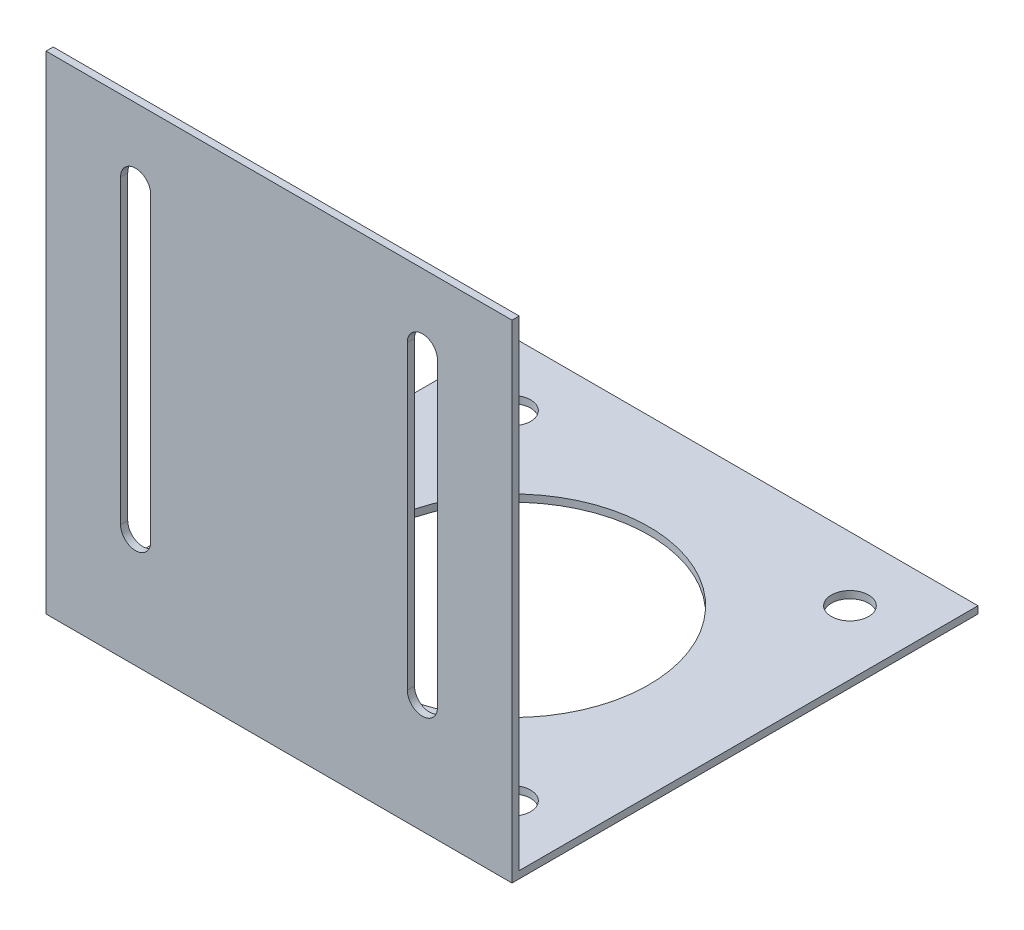
ISO-10303-21;
HEADER;
FILE_DESCRIPTION(('STEP AP214'),'2;1');
FILE_NAME('part.step','',(''),(''),'','','');
FILE_SCHEMA(('AUTOMOTIVE_DESIGN { 1 0 10303 214 1 1 1 1 }'));
ENDSEC;
DATA;
#1=APPLICATION_CONTEXT('core data for automotive mechanical design processes');
#2=APPLICATION_PROTOCOL_DEFINITION('international standard','automotive_design',2000,#1);
#3=PRODUCT_CONTEXT('',#1,'mechanical');
#4=PRODUCT('Part','Part','',(#3));
#5=PRODUCT_RELATED_PRODUCT_CATEGORY('part','',(#4));
#6=PRODUCT_DEFINITION_FORMATION('','',#4);
#7=PRODUCT_DEFINITION_CONTEXT('part definition',#1,'design');
#8=PRODUCT_DEFINITION('design','',#6,#7);
#9=PRODUCT_DEFINITION_SHAPE('','',#8);
#10=(LENGTH_UNIT() NAMED_UNIT(*) SI_UNIT(.MILLI.,.METRE.));
#11=(NAMED_UNIT(*) PLANE_ANGLE_UNIT() SI_UNIT($,.RADIAN.));
#12=(NAMED_UNIT(*) SI_UNIT($,.STERADIAN.) SOLID_ANGLE_UNIT());
#13=UNCERTAINTY_MEASURE_WITH_UNIT(LENGTH_MEASURE(1.E-05),#10,'distance_accuracy_value','');
#14=(GEOMETRIC_REPRESENTATION_CONTEXT(3) GLOBAL_UNCERTAINTY_ASSIGNED_CONTEXT((#13)) GLOBAL_UNIT_ASSIGNED_CONTEXT((#10,
#11,#12)) REPRESENTATION_CONTEXT('',''));
#15=CARTESIAN_POINT('',(0.,0.,0.));
#16=DIRECTION('',(0.,0.,1.));
#17=DIRECTION('',(1.,0.,0.));
#18=AXIS2_PLACEMENT_3D('',#15,#16,#17);
#19=CARTESIAN_POINT('',(0.,1.,0.));
#20=DIRECTION('',(0.,1.,0.));
#21=DIRECTION('',(0.,0.,1.));
#22=AXIS2_PLACEMENT_3D('',#19,#20,#21);
#23=PLANE('',#22);
#24=DIRECTION('',(-1.,0.,0.));
#25=VECTOR('',#24,1.);
#26=CARTESIAN_POINT('',(-32.5,1.,31.5));
#27=LINE('',#26,#25);
#28=CARTESIAN_POINT('',(32.5,1.,31.5));
#29=VERTEX_POINT('',#28);
#30=CARTESIAN_POINT('',(-32.5,1.,31.5));
#31=VERTEX_POINT('',#30);
#32=EDGE_CURVE('E172',#29,#31,#27,.T.);
#33=ORIENTED_EDGE('',*,*,#32,.F.);
#34=DIRECTION('',(0.,0.,-1.));
#35=VECTOR('',#34,1.);
#36=CARTESIAN_POINT('',(32.5,1.,-32.5));
#37=LINE('',#36,#35);
#38=CARTESIAN_POINT('',(32.5,1.,-32.5));
#39=VERTEX_POINT('',#38);
#40=EDGE_CURVE('E254',#29,#39,#37,.T.);
#41=ORIENTED_EDGE('',*,*,#40,.T.);
#42=DIRECTION('',(-1.,0.,0.));
#43=VECTOR('',#42,1.);
#44=CARTESIAN_POINT('',(-32.5,1.,-32.5));
#45=LINE('',#44,#43);
#46=CARTESIAN_POINT('',(-32.5,1.,-32.5));
#47=VERTEX_POINT('',#46);
#48=EDGE_CURVE('E256',#39,#47,#45,.T.);
#49=ORIENTED_EDGE('',*,*,#48,.T.);
#50=DIRECTION('',(0.,0.,1.));
#51=VECTOR('',#50,1.);
#52=CARTESIAN_POINT('',(-32.5,1.,-32.5));
#53=LINE('',#52,#51);
#54=EDGE_CURVE('E259',#47,#31,#53,.T.);
#55=ORIENTED_EDGE('',*,*,#54,.T.);
#56=EDGE_LOOP('',(#33,#41,#49,#55));
#57=FACE_BOUND('',#56,.T.);
#58=CARTESIAN_POINT('',(-23.57,1.,23.57));
#59=DIRECTION('',(0.,1.,0.));
#60=DIRECTION('',(0.,0.,-1.));
#61=AXIS2_PLACEMENT_3D('',#58,#59,#60);
#62=CIRCLE('',#61,2.6);
#63=CARTESIAN_POINT('',(-23.57,1.,20.97));
#64=VERTEX_POINT('',#63);
#65=EDGE_CURVE('E230',#64,#64,#62,.T.);
#66=ORIENTED_EDGE('',*,*,#65,.F.);
#67=EDGE_LOOP('',(#66));
#68=FACE_BOUND('',#67,.T.);
#69=CARTESIAN_POINT('',(23.57,1.,-23.57));
#70=DIRECTION('',(0.,1.,0.));
#71=DIRECTION('',(0.,0.,-1.));
#72=AXIS2_PLACEMENT_3D('',#69,#70,#71);
#73=CIRCLE('',#72,2.6);
#74=CARTESIAN_POINT('',(23.57,1.,-26.17));
#75=VERTEX_POINT('',#74);
#76=EDGE_CURVE('E242',#75,#75,#73,.T.);
#77=ORIENTED_EDGE('',*,*,#76,.F.);
#78=EDGE_LOOP('',(#77));
#79=FACE_BOUND('',#78,.T.);
#80=CARTESIAN_POINT('',(-23.57,1.,-23.57));
#81=DIRECTION('',(0.,1.,0.));
#82=DIRECTION('',(0.,0.,1.));
#83=AXIS2_PLACEMENT_3D('',#80,#81,#82);
#84=CIRCLE('',#83,2.6);
#85=CARTESIAN_POINT('',(-23.57,1.,-20.97));
#86=VERTEX_POINT('',#85);
#87=EDGE_CURVE('E248',#86,#86,#84,.T.);
#88=ORIENTED_EDGE('',*,*,#87,.F.);
#89=EDGE_LOOP('',(#88));
#90=FACE_BOUND('',#89,.T.);
#91=CARTESIAN_POINT('',(23.57,1.,23.57));
#92=DIRECTION('',(0.,1.,0.));
#93=DIRECTION('',(0.,0.,1.));
#94=AXIS2_PLACEMENT_3D('',#91,#92,#93);
#95=CIRCLE('',#94,2.6);
#96=CARTESIAN_POINT('',(23.57,1.,26.17));
#97=VERTEX_POINT('',#96);
#98=EDGE_CURVE('E236',#97,#97,#95,.T.);
#99=ORIENTED_EDGE('',*,*,#98,.F.);
#100=EDGE_LOOP('',(#99));
#101=FACE_BOUND('',#100,.T.);
#102=CARTESIAN_POINT('',(0.,1.,0.));
#103=DIRECTION('',(0.,1.,0.));
#104=DIRECTION('',(0.,0.,1.));
#105=AXIS2_PLACEMENT_3D('',#102,#103,#104);
#106=CIRCLE('',#105,19.1);
#107=CARTESIAN_POINT('',(0.,1.,19.1));
#108=VERTEX_POINT('',#107);
#109=EDGE_CURVE('E224',#108,#108,#106,.T.);
#110=ORIENTED_EDGE('',*,*,#109,.F.);
#111=EDGE_LOOP('',(#110));
#112=FACE_BOUND('',#111,.T.);
#113=ADVANCED_FACE('F33',(#57,#68,#79,#90,#101,#112),#23,.T.);
#114=CARTESIAN_POINT('',(0.,0.,0.));
#115=DIRECTION('',(0.,1.,0.));
#116=DIRECTION('',(0.,0.,1.));
#117=AXIS2_PLACEMENT_3D('',#114,#115,#116);
#118=PLANE('',#117);
#119=DIRECTION('',(0.,0.,-1.));
#120=VECTOR('',#119,1.);
#121=CARTESIAN_POINT('',(32.5,0.,-32.5));
#122=LINE('',#121,#120);
#123=CARTESIAN_POINT('',(32.5,0.,32.5));
#124=VERTEX_POINT('',#123);
#125=CARTESIAN_POINT('',(32.5,0.,-32.5));
#126=VERTEX_POINT('',#125);
#127=EDGE_CURVE('E251',#124,#126,#122,.T.);
#128=ORIENTED_EDGE('',*,*,#127,.F.);
#129=DIRECTION('',(1.,0.,0.));
#130=VECTOR('',#129,1.);
#131=CARTESIAN_POINT('',(-32.5,0.,32.5));
#132=LINE('',#131,#130);
#133=CARTESIAN_POINT('',(-32.5,0.,32.5));
#134=VERTEX_POINT('',#133);
#135=EDGE_CURVE('E257',#134,#124,#132,.T.);
#136=ORIENTED_EDGE('',*,*,#135,.F.);
#137=DIRECTION('',(0.,0.,1.));
#138=VECTOR('',#137,1.);
#139=CARTESIAN_POINT('',(-32.5,0.,-32.5));
#140=LINE('',#139,#138);
#141=CARTESIAN_POINT('',(-32.5,0.,-32.5));
#142=VERTEX_POINT('',#141);
#143=EDGE_CURVE('E266',#142,#134,#140,.T.);
#144=ORIENTED_EDGE('',*,*,#143,.F.);
#145=DIRECTION('',(-1.,0.,0.));
#146=VECTOR('',#145,1.);
#147=CARTESIAN_POINT('',(-32.5,0.,-32.5));
#148=LINE('',#147,#146);
#149=EDGE_CURVE('E264',#126,#142,#148,.T.);
#150=ORIENTED_EDGE('',*,*,#149,.F.);
#151=EDGE_LOOP('',(#128,#136,#144,#150));
#152=FACE_BOUND('',#151,.T.);
#153=CARTESIAN_POINT('',(-23.57,0.,-23.57));
#154=DIRECTION('',(0.,1.,0.));
#155=DIRECTION('',(0.,0.,1.));
#156=AXIS2_PLACEMENT_3D('',#153,#154,#155);
#157=CIRCLE('',#156,2.6);
#158=CARTESIAN_POINT('',(-23.57,0.,-20.97));
#159=VERTEX_POINT('',#158);
#160=EDGE_CURVE('E245',#159,#159,#157,.T.);
#161=ORIENTED_EDGE('',*,*,#160,.T.);
#162=EDGE_LOOP('',(#161));
#163=FACE_BOUND('',#162,.T.);
#164=CARTESIAN_POINT('',(23.57,0.,-23.57));
#165=DIRECTION('',(0.,1.,0.));
#166=DIRECTION('',(0.,0.,-1.));
#167=AXIS2_PLACEMENT_3D('',#164,#165,#166);
#168=CIRCLE('',#167,2.6);
#169=CARTESIAN_POINT('',(23.57,0.,-26.17));
#170=VERTEX_POINT('',#169);
#171=EDGE_CURVE('E239',#170,#170,#168,.T.);
#172=ORIENTED_EDGE('',*,*,#171,.T.);
#173=EDGE_LOOP('',(#172));
#174=FACE_BOUND('',#173,.T.);
#175=CARTESIAN_POINT('',(23.57,0.,23.57));
#176=DIRECTION('',(0.,1.,0.));
#177=DIRECTION('',(0.,0.,1.));
#178=AXIS2_PLACEMENT_3D('',#175,#176,#177);
#179=CIRCLE('',#178,2.6);
#180=CARTESIAN_POINT('',(23.57,0.,26.17));
#181=VERTEX_POINT('',#180);
#182=EDGE_CURVE('E233',#181,#181,#179,.T.);
#183=ORIENTED_EDGE('',*,*,#182,.T.);
#184=EDGE_LOOP('',(#183));
#185=FACE_BOUND('',#184,.T.);
#186=CARTESIAN_POINT('',(-23.57,0.,23.57));
#187=DIRECTION('',(0.,1.,0.));
#188=DIRECTION('',(0.,0.,-1.));
#189=AXIS2_PLACEMENT_3D('',#186,#187,#188);
#190=CIRCLE('',#189,2.6);
#191=CARTESIAN_POINT('',(-23.57,0.,20.97));
#192=VERTEX_POINT('',#191);
#193=EDGE_CURVE('E227',#192,#192,#190,.T.);
#194=ORIENTED_EDGE('',*,*,#193,.T.);
#195=EDGE_LOOP('',(#194));
#196=FACE_BOUND('',#195,.T.);
#197=CARTESIAN_POINT('',(0.,0.,0.));
#198=DIRECTION('',(0.,1.,0.));
#199=DIRECTION('',(0.,0.,1.));
#200=AXIS2_PLACEMENT_3D('',#197,#198,#199);
#201=CIRCLE('',#200,19.1);
#202=CARTESIAN_POINT('',(0.,0.,19.1));
#203=VERTEX_POINT('',#202);
#204=EDGE_CURVE('E223',#203,#203,#201,.T.);
#205=ORIENTED_EDGE('',*,*,#204,.T.);
#206=EDGE_LOOP('',(#205));
#207=FACE_BOUND('',#206,.T.);
#208=ADVANCED_FACE('F284',(#152,#163,#174,#185,#196,#207),#118,.F.);
#209=CARTESIAN_POINT('',(32.5,1.,-32.5));
#210=DIRECTION('',(-1.,0.,0.));
#211=DIRECTION('',(0.,0.,1.));
#212=AXIS2_PLACEMENT_3D('',#209,#210,#211);
#213=PLANE('',#212);
#214=ORIENTED_EDGE('',*,*,#127,.T.);
#215=DIRECTION('',(0.,-1.,0.));
#216=VECTOR('',#215,1.);
#217=CARTESIAN_POINT('',(32.5,1.,-32.5));
#218=LINE('',#217,#216);
#219=EDGE_CURVE('E11',#39,#126,#218,.T.);
#220=ORIENTED_EDGE('',*,*,#219,.F.);
#221=ORIENTED_EDGE('',*,*,#40,.F.);
#222=DIRECTION('',(0.,-1.,0.));
#223=VECTOR('',#222,1.);
#224=CARTESIAN_POINT('',(32.5,68.,31.5));
#225=LINE('',#224,#223);
#226=CARTESIAN_POINT('',(32.5,68.,31.5));
#227=VERTEX_POINT('',#226);
#228=EDGE_CURVE('E220',#227,#29,#225,.T.);
#229=ORIENTED_EDGE('',*,*,#228,.F.);
#230=DIRECTION('',(0.,0.,-1.));
#231=VECTOR('',#230,1.);
#232=CARTESIAN_POINT('',(32.5,68.,32.5));
#233=LINE('',#232,#231);
#234=CARTESIAN_POINT('',(32.5,68.,32.5));
#235=VERTEX_POINT('',#234);
#236=EDGE_CURVE('E211',#235,#227,#233,.T.);
#237=ORIENTED_EDGE('',*,*,#236,.F.);
#238=DIRECTION('',(0.,-1.,0.));
#239=VECTOR('',#238,1.);
#240=CARTESIAN_POINT('',(32.5,1.,32.5));
#241=LINE('',#240,#239);
#242=EDGE_CURVE('E261',#235,#124,#241,.T.);
#243=ORIENTED_EDGE('',*,*,#242,.T.);
#244=EDGE_LOOP('',(#214,#220,#221,#229,#237,#243));
#245=FACE_BOUND('',#244,.T.);
#246=ADVANCED_FACE('F35',(#245),#213,.F.);
#247=CARTESIAN_POINT('',(-32.5,1.,-32.5));
#248=DIRECTION('',(0.,0.,1.));
#249=DIRECTION('',(1.,0.,0.));
#250=AXIS2_PLACEMENT_3D('',#247,#248,#249);
#251=PLANE('',#250);
#252=ORIENTED_EDGE('',*,*,#149,.T.);
#253=DIRECTION('',(0.,-1.,0.));
#254=VECTOR('',#253,1.);
#255=CARTESIAN_POINT('',(-32.5,1.,-32.5));
#256=LINE('',#255,#254);
#257=EDGE_CURVE('E41',#47,#142,#256,.T.);
#258=ORIENTED_EDGE('',*,*,#257,.F.);
#259=ORIENTED_EDGE('',*,*,#48,.F.);
#260=ORIENTED_EDGE('',*,*,#219,.T.);
#261=EDGE_LOOP('',(#252,#258,#259,#260));
#262=FACE_BOUND('',#261,.T.);
#263=ADVANCED_FACE('F302',(#262),#251,.F.);
#264=CARTESIAN_POINT('',(-32.5,1.,-32.5));
#265=DIRECTION('',(1.,0.,0.));
#266=DIRECTION('',(0.,0.,-1.));
#267=AXIS2_PLACEMENT_3D('',#264,#265,#266);
#268=PLANE('',#267);
#269=ORIENTED_EDGE('',*,*,#143,.T.);
#270=DIRECTION('',(0.,-1.,0.));
#271=VECTOR('',#270,1.);
#272=CARTESIAN_POINT('',(-32.5,1.,32.5));
#273=LINE('',#272,#271);
#274=CARTESIAN_POINT('',(-32.5,68.,32.5));
#275=VERTEX_POINT('',#274);
#276=EDGE_CURVE('E271',#275,#134,#273,.T.);
#277=ORIENTED_EDGE('',*,*,#276,.F.);
#278=DIRECTION('',(0.,0.,1.));
#279=VECTOR('',#278,1.);
#280=CARTESIAN_POINT('',(-32.5,68.,32.5));
#281=LINE('',#280,#279);
#282=CARTESIAN_POINT('',(-32.5,68.,31.5));
#283=VERTEX_POINT('',#282);
#284=EDGE_CURVE('E205',#283,#275,#281,.T.);
#285=ORIENTED_EDGE('',*,*,#284,.F.);
#286=DIRECTION('',(0.,-1.,0.));
#287=VECTOR('',#286,1.);
#288=CARTESIAN_POINT('',(-32.5,68.,31.5));
#289=LINE('',#288,#287);
#290=EDGE_CURVE('E215',#283,#31,#289,.T.);
#291=ORIENTED_EDGE('',*,*,#290,.T.);
#292=ORIENTED_EDGE('',*,*,#54,.F.);
#293=ORIENTED_EDGE('',*,*,#257,.T.);
#294=EDGE_LOOP('',(#269,#277,#285,#291,#292,#293));
#295=FACE_BOUND('',#294,.T.);
#296=ADVANCED_FACE('F278',(#295),#268,.F.);
#297=CARTESIAN_POINT('',(-32.5,1.,32.5));
#298=DIRECTION('',(0.,0.,-1.));
#299=DIRECTION('',(-1.,0.,0.));
#300=AXIS2_PLACEMENT_3D('',#297,#298,#299);
#301=PLANE('',#300);
#302=DIRECTION('',(0.,1.,0.));
#303=VECTOR('',#302,1.);
#304=CARTESIAN_POINT('',(17.9,58.,32.5));
#305=LINE('',#304,#303);
#306=CARTESIAN_POINT('',(17.9,16.,32.5));
#307=VERTEX_POINT('',#306);
#308=CARTESIAN_POINT('',(17.9,58.,32.5));
#309=VERTEX_POINT('',#308);
#310=EDGE_CURVE('E146',#307,#309,#305,.T.);
#311=ORIENTED_EDGE('',*,*,#310,.T.);
#312=CARTESIAN_POINT('',(20.,58.,32.5));
#313=DIRECTION('',(0.,0.,-1.));
#314=DIRECTION('',(-1.,0.,0.));
#315=AXIS2_PLACEMENT_3D('',#312,#313,#314);
#316=CIRCLE('',#315,2.1);
#317=CARTESIAN_POINT('',(22.1,58.,32.5));
#318=VERTEX_POINT('',#317);
#319=EDGE_CURVE('E138',#309,#318,#316,.T.);
#320=ORIENTED_EDGE('',*,*,#319,.T.);
#321=DIRECTION('',(0.,-1.,0.));
#322=VECTOR('',#321,1.);
#323=CARTESIAN_POINT('',(22.1,58.,32.5));
#324=LINE('',#323,#322);
#325=CARTESIAN_POINT('',(22.1,16.,32.5));
#326=VERTEX_POINT('',#325);
#327=EDGE_CURVE('E149',#318,#326,#324,.T.);
#328=ORIENTED_EDGE('',*,*,#327,.T.);
#329=CARTESIAN_POINT('',(20.,16.,32.5));
#330=DIRECTION('',(0.,0.,-1.));
#331=DIRECTION('',(-1.,0.,0.));
#332=AXIS2_PLACEMENT_3D('',#329,#330,#331);
#333=CIRCLE('',#332,2.10000000000001);
#334=EDGE_CURVE('E48',#326,#307,#333,.T.);
#335=ORIENTED_EDGE('',*,*,#334,.T.);
#336=EDGE_LOOP('',(#311,#320,#328,#335));
#337=FACE_BOUND('',#336,.T.);
#338=DIRECTION('',(0.,1.,0.));
#339=VECTOR('',#338,1.);
#340=CARTESIAN_POINT('',(-22.1,58.,32.5));
#341=LINE('',#340,#339);
#342=CARTESIAN_POINT('',(-22.1,16.,32.5));
#343=VERTEX_POINT('',#342);
#344=CARTESIAN_POINT('',(-22.1,58.,32.5));
#345=VERTEX_POINT('',#344);
#346=EDGE_CURVE('E184',#343,#345,#341,.T.);
#347=ORIENTED_EDGE('',*,*,#346,.T.);
#348=CARTESIAN_POINT('',(-20.,58.,32.5));
#349=DIRECTION('',(0.,0.,-1.));
#350=DIRECTION('',(1.,0.,0.));
#351=AXIS2_PLACEMENT_3D('',#348,#349,#350);
#352=CIRCLE('',#351,2.1);
#353=CARTESIAN_POINT('',(-17.9,58.,32.5));
#354=VERTEX_POINT('',#353);
#355=EDGE_CURVE('E176',#345,#354,#352,.T.);
#356=ORIENTED_EDGE('',*,*,#355,.T.);
#357=DIRECTION('',(0.,-1.,0.));
#358=VECTOR('',#357,1.);
#359=CARTESIAN_POINT('',(-17.9,58.,32.5));
#360=LINE('',#359,#358);
#361=CARTESIAN_POINT('',(-17.9,16.,32.5));
#362=VERTEX_POINT('',#361);
#363=EDGE_CURVE('E179',#354,#362,#360,.T.);
#364=ORIENTED_EDGE('',*,*,#363,.T.);
#365=CARTESIAN_POINT('',(-20.,16.,32.5));
#366=DIRECTION('',(0.,0.,-1.));
#367=DIRECTION('',(1.,0.,0.));
#368=AXIS2_PLACEMENT_3D('',#365,#366,#367);
#369=CIRCLE('',#368,2.10000000000001);
#370=EDGE_CURVE('E56',#362,#343,#369,.T.);
#371=ORIENTED_EDGE('',*,*,#370,.T.);
#372=EDGE_LOOP('',(#347,#356,#364,#371));
#373=FACE_BOUND('',#372,.T.);
#374=ORIENTED_EDGE('',*,*,#135,.T.);
#375=ORIENTED_EDGE('',*,*,#242,.F.);
#376=DIRECTION('',(1.,0.,0.));
#377=VECTOR('',#376,1.);
#378=CARTESIAN_POINT('',(-32.5,68.,32.5));
#379=LINE('',#378,#377);
#380=EDGE_CURVE('E208',#275,#235,#379,.T.);
#381=ORIENTED_EDGE('',*,*,#380,.F.);
#382=ORIENTED_EDGE('',*,*,#276,.T.);
#383=EDGE_LOOP('',(#374,#375,#381,#382));
#384=FACE_BOUND('',#383,.T.);
#385=ADVANCED_FACE('F153',(#337,#373,#384),#301,.F.);
#386=CARTESIAN_POINT('',(-23.57,1.,-23.57));
#387=DIRECTION('',(0.,-1.,0.));
#388=DIRECTION('',(0.,0.,-1.));
#389=AXIS2_PLACEMENT_3D('',#386,#387,#388);
#390=CYLINDRICAL_SURFACE('',#389,2.6);
#391=ORIENTED_EDGE('',*,*,#87,.T.);
#392=EDGE_LOOP('',(#391));
#393=FACE_BOUND('',#392,.T.);
#394=ORIENTED_EDGE('',*,*,#160,.F.);
#395=EDGE_LOOP('',(#394));
#396=FACE_BOUND('',#395,.T.);
#397=ADVANCED_FACE('F316',(#393,#396),#390,.F.);
#398=CARTESIAN_POINT('',(23.57,1.,-23.57));
#399=DIRECTION('',(0.,-1.,0.));
#400=DIRECTION('',(0.,0.,-1.));
#401=AXIS2_PLACEMENT_3D('',#398,#399,#400);
#402=CYLINDRICAL_SURFACE('',#401,2.6);
#403=ORIENTED_EDGE('',*,*,#76,.T.);
#404=EDGE_LOOP('',(#403));
#405=FACE_BOUND('',#404,.T.);
#406=ORIENTED_EDGE('',*,*,#171,.F.);
#407=EDGE_LOOP('',(#406));
#408=FACE_BOUND('',#407,.T.);
#409=ADVANCED_FACE('F323',(#405,#408),#402,.F.);
#410=CARTESIAN_POINT('',(23.57,1.,23.57));
#411=DIRECTION('',(0.,-1.,0.));
#412=DIRECTION('',(0.,0.,-1.));
#413=AXIS2_PLACEMENT_3D('',#410,#411,#412);
#414=CYLINDRICAL_SURFACE('',#413,2.6);
#415=ORIENTED_EDGE('',*,*,#98,.T.);
#416=EDGE_LOOP('',(#415));
#417=FACE_BOUND('',#416,.T.);
#418=ORIENTED_EDGE('',*,*,#182,.F.);
#419=EDGE_LOOP('',(#418));
#420=FACE_BOUND('',#419,.T.);
#421=ADVANCED_FACE('F328',(#417,#420),#414,.F.);
#422=CARTESIAN_POINT('',(-23.57,1.,23.57));
#423=DIRECTION('',(0.,-1.,0.));
#424=DIRECTION('',(0.,0.,-1.));
#425=AXIS2_PLACEMENT_3D('',#422,#423,#424);
#426=CYLINDRICAL_SURFACE('',#425,2.6);
#427=ORIENTED_EDGE('',*,*,#65,.T.);
#428=EDGE_LOOP('',(#427));
#429=FACE_BOUND('',#428,.T.);
#430=ORIENTED_EDGE('',*,*,#193,.F.);
#431=EDGE_LOOP('',(#430));
#432=FACE_BOUND('',#431,.T.);
#433=ADVANCED_FACE('F344',(#429,#432),#426,.F.);
#434=CARTESIAN_POINT('',(0.,1.,0.));
#435=DIRECTION('',(0.,-1.,0.));
#436=DIRECTION('',(0.,0.,-1.));
#437=AXIS2_PLACEMENT_3D('',#434,#435,#436);
#438=CYLINDRICAL_SURFACE('',#437,19.1);
#439=ORIENTED_EDGE('',*,*,#109,.T.);
#440=EDGE_LOOP('',(#439));
#441=FACE_BOUND('',#440,.T.);
#442=ORIENTED_EDGE('',*,*,#204,.F.);
#443=EDGE_LOOP('',(#442));
#444=FACE_BOUND('',#443,.T.);
#445=ADVANCED_FACE('F342',(#441,#444),#438,.F.);
#446=CARTESIAN_POINT('',(-32.5,68.,31.5));
#447=DIRECTION('',(0.,0.,1.));
#448=DIRECTION('',(1.,0.,0.));
#449=AXIS2_PLACEMENT_3D('',#446,#447,#448);
#450=PLANE('',#449);
#451=DIRECTION('',(0.,-1.,0.));
#452=VECTOR('',#451,1.);
#453=CARTESIAN_POINT('',(22.1,58.,31.5));
#454=LINE('',#453,#452);
#455=CARTESIAN_POINT('',(22.1,58.,31.5));
#456=VERTEX_POINT('',#455);
#457=CARTESIAN_POINT('',(22.1,16.,31.5));
#458=VERTEX_POINT('',#457);
#459=EDGE_CURVE('E165',#456,#458,#454,.T.);
#460=ORIENTED_EDGE('',*,*,#459,.F.);
#461=CARTESIAN_POINT('',(20.,58.,31.5));
#462=DIRECTION('',(0.,0.,-1.));
#463=DIRECTION('',(-1.,0.,0.));
#464=AXIS2_PLACEMENT_3D('',#461,#462,#463);
#465=CIRCLE('',#464,2.1);
#466=CARTESIAN_POINT('',(17.9,58.,31.5));
#467=VERTEX_POINT('',#466);
#468=EDGE_CURVE('E141',#467,#456,#465,.T.);
#469=ORIENTED_EDGE('',*,*,#468,.F.);
#470=DIRECTION('',(0.,1.,0.));
#471=VECTOR('',#470,1.);
#472=CARTESIAN_POINT('',(17.9,58.,31.5));
#473=LINE('',#472,#471);
#474=CARTESIAN_POINT('',(17.9,16.,31.5));
#475=VERTEX_POINT('',#474);
#476=EDGE_CURVE('E156',#475,#467,#473,.T.);
#477=ORIENTED_EDGE('',*,*,#476,.F.);
#478=CARTESIAN_POINT('',(20.,16.,31.5));
#479=DIRECTION('',(0.,0.,-1.));
#480=DIRECTION('',(-1.,0.,0.));
#481=AXIS2_PLACEMENT_3D('',#478,#479,#480);
#482=CIRCLE('',#481,2.10000000000001);
#483=EDGE_CURVE('E159',#458,#475,#482,.T.);
#484=ORIENTED_EDGE('',*,*,#483,.F.);
#485=EDGE_LOOP('',(#460,#469,#477,#484));
#486=FACE_BOUND('',#485,.T.);
#487=DIRECTION('',(0.,-1.,0.));
#488=VECTOR('',#487,1.);
#489=CARTESIAN_POINT('',(-17.9,58.,31.5));
#490=LINE('',#489,#488);
#491=CARTESIAN_POINT('',(-17.9,58.,31.5));
#492=VERTEX_POINT('',#491);
#493=CARTESIAN_POINT('',(-17.9,16.,31.5));
#494=VERTEX_POINT('',#493);
#495=EDGE_CURVE('E190',#492,#494,#490,.T.);
#496=ORIENTED_EDGE('',*,*,#495,.F.);
#497=CARTESIAN_POINT('',(-20.,58.,31.5));
#498=DIRECTION('',(0.,0.,-1.));
#499=DIRECTION('',(1.,0.,0.));
#500=AXIS2_PLACEMENT_3D('',#497,#498,#499);
#501=CIRCLE('',#500,2.1);
#502=CARTESIAN_POINT('',(-22.1,58.,31.5));
#503=VERTEX_POINT('',#502);
#504=EDGE_CURVE('E188',#503,#492,#501,.T.);
#505=ORIENTED_EDGE('',*,*,#504,.F.);
#506=DIRECTION('',(0.,1.,0.));
#507=VECTOR('',#506,1.);
#508=CARTESIAN_POINT('',(-22.1,58.,31.5));
#509=LINE('',#508,#507);
#510=CARTESIAN_POINT('',(-22.1,16.,31.5));
#511=VERTEX_POINT('',#510);
#512=EDGE_CURVE('E180',#511,#503,#509,.T.);
#513=ORIENTED_EDGE('',*,*,#512,.F.);
#514=CARTESIAN_POINT('',(-20.,16.,31.5));
#515=DIRECTION('',(0.,0.,-1.));
#516=DIRECTION('',(1.,0.,0.));
#517=AXIS2_PLACEMENT_3D('',#514,#515,#516);
#518=CIRCLE('',#517,2.10000000000001);
#519=EDGE_CURVE('E193',#494,#511,#518,.T.);
#520=ORIENTED_EDGE('',*,*,#519,.F.);
#521=EDGE_LOOP('',(#496,#505,#513,#520));
#522=FACE_BOUND('',#521,.T.);
#523=ORIENTED_EDGE('',*,*,#32,.T.);
#524=ORIENTED_EDGE('',*,*,#290,.F.);
#525=DIRECTION('',(-1.,0.,0.));
#526=VECTOR('',#525,1.);
#527=CARTESIAN_POINT('',(-32.5,68.,31.5));
#528=LINE('',#527,#526);
#529=EDGE_CURVE('E213',#227,#283,#528,.T.);
#530=ORIENTED_EDGE('',*,*,#529,.F.);
#531=ORIENTED_EDGE('',*,*,#228,.T.);
#532=EDGE_LOOP('',(#523,#524,#530,#531));
#533=FACE_BOUND('',#532,.T.);
#534=ADVANCED_FACE('F299',(#486,#522,#533),#450,.F.);
#535=CARTESIAN_POINT('',(0.,68.,0.));
#536=DIRECTION('',(0.,-1.,0.));
#537=DIRECTION('',(0.,0.,-1.));
#538=AXIS2_PLACEMENT_3D('',#535,#536,#537);
#539=PLANE('',#538);
#540=ORIENTED_EDGE('',*,*,#284,.T.);
#541=ORIENTED_EDGE('',*,*,#380,.T.);
#542=ORIENTED_EDGE('',*,*,#236,.T.);
#543=ORIENTED_EDGE('',*,*,#529,.T.);
#544=EDGE_LOOP('',(#540,#541,#542,#543));
#545=FACE_BOUND('',#544,.T.);
#546=ADVANCED_FACE('F295',(#545),#539,.F.);
#547=CARTESIAN_POINT('',(-20.,58.,32.5));
#548=DIRECTION('',(0.,0.,-1.));
#549=DIRECTION('',(-1.,0.,0.));
#550=AXIS2_PLACEMENT_3D('',#547,#548,#549);
#551=CYLINDRICAL_SURFACE('',#550,2.1);
#552=ORIENTED_EDGE('',*,*,#504,.T.);
#553=DIRECTION('',(0.,0.,-1.));
#554=VECTOR('',#553,1.);
#555=CARTESIAN_POINT('',(-17.9,58.,32.5));
#556=LINE('',#555,#554);
#557=EDGE_CURVE('E187',#354,#492,#556,.T.);
#558=ORIENTED_EDGE('',*,*,#557,.F.);
#559=ORIENTED_EDGE('',*,*,#355,.F.);
#560=DIRECTION('',(0.,0.,-1.));
#561=VECTOR('',#560,1.);
#562=CARTESIAN_POINT('',(-22.1,58.,32.5));
#563=LINE('',#562,#561);
#564=EDGE_CURVE('E166',#345,#503,#563,.T.);
#565=ORIENTED_EDGE('',*,*,#564,.T.);
#566=EDGE_LOOP('',(#552,#558,#559,#565));
#567=FACE_BOUND('',#566,.T.);
#568=ADVANCED_FACE('F404',(#567),#551,.F.);
#569=CARTESIAN_POINT('',(-22.1,58.,32.5));
#570=DIRECTION('',(-1.,0.,0.));
#571=DIRECTION('',(0.,-1.,0.));
#572=AXIS2_PLACEMENT_3D('',#569,#570,#571);
#573=PLANE('',#572);
#574=ORIENTED_EDGE('',*,*,#512,.T.);
#575=ORIENTED_EDGE('',*,*,#564,.F.);
#576=ORIENTED_EDGE('',*,*,#346,.F.);
#577=DIRECTION('',(0.,0.,-1.));
#578=VECTOR('',#577,1.);
#579=CARTESIAN_POINT('',(-22.1,16.,32.5));
#580=LINE('',#579,#578);
#581=EDGE_CURVE('E199',#343,#511,#580,.T.);
#582=ORIENTED_EDGE('',*,*,#581,.T.);
#583=EDGE_LOOP('',(#574,#575,#576,#582));
#584=FACE_BOUND('',#583,.T.);
#585=ADVANCED_FACE('F423',(#584),#573,.F.);
#586=CARTESIAN_POINT('',(-20.,16.,32.5));
#587=DIRECTION('',(0.,0.,-1.));
#588=DIRECTION('',(-1.,0.,0.));
#589=AXIS2_PLACEMENT_3D('',#586,#587,#588);
#590=CYLINDRICAL_SURFACE('',#589,2.10000000000001);
#591=ORIENTED_EDGE('',*,*,#519,.T.);
#592=ORIENTED_EDGE('',*,*,#581,.F.);
#593=ORIENTED_EDGE('',*,*,#370,.F.);
#594=DIRECTION('',(0.,0.,-1.));
#595=VECTOR('',#594,1.);
#596=CARTESIAN_POINT('',(-17.9,16.,32.5));
#597=LINE('',#596,#595);
#598=EDGE_CURVE('E201',#362,#494,#597,.T.);
#599=ORIENTED_EDGE('',*,*,#598,.T.);
#600=EDGE_LOOP('',(#591,#592,#593,#599));
#601=FACE_BOUND('',#600,.T.);
#602=ADVANCED_FACE('F433',(#601),#590,.F.);
#603=CARTESIAN_POINT('',(-17.9,58.,32.5));
#604=DIRECTION('',(1.,0.,0.));
#605=DIRECTION('',(0.,1.,0.));
#606=AXIS2_PLACEMENT_3D('',#603,#604,#605);
#607=PLANE('',#606);
#608=ORIENTED_EDGE('',*,*,#495,.T.);
#609=ORIENTED_EDGE('',*,*,#598,.F.);
#610=ORIENTED_EDGE('',*,*,#363,.F.);
#611=ORIENTED_EDGE('',*,*,#557,.T.);
#612=EDGE_LOOP('',(#608,#609,#610,#611));
#613=FACE_BOUND('',#612,.T.);
#614=ADVANCED_FACE('F443',(#613),#607,.F.);
#615=CARTESIAN_POINT('',(20.,58.,32.5));
#616=DIRECTION('',(0.,0.,-1.));
#617=DIRECTION('',(-1.,0.,0.));
#618=AXIS2_PLACEMENT_3D('',#615,#616,#617);
#619=CYLINDRICAL_SURFACE('',#618,2.1);
#620=ORIENTED_EDGE('',*,*,#468,.T.);
#621=DIRECTION('',(0.,0.,-1.));
#622=VECTOR('',#621,1.);
#623=CARTESIAN_POINT('',(22.1,58.,32.5));
#624=LINE('',#623,#622);
#625=EDGE_CURVE('E134',#318,#456,#624,.T.);
#626=ORIENTED_EDGE('',*,*,#625,.F.);
#627=ORIENTED_EDGE('',*,*,#319,.F.);
#628=DIRECTION('',(0.,0.,-1.));
#629=VECTOR('',#628,1.);
#630=CARTESIAN_POINT('',(17.9,58.,32.5));
#631=LINE('',#630,#629);
#632=EDGE_CURVE('E170',#309,#467,#631,.T.);
#633=ORIENTED_EDGE('',*,*,#632,.T.);
#634=EDGE_LOOP('',(#620,#626,#627,#633));
#635=FACE_BOUND('',#634,.T.);
#636=ADVANCED_FACE('F136',(#635),#619,.F.);
#637=CARTESIAN_POINT('',(17.9,58.,32.5));
#638=DIRECTION('',(-1.,0.,0.));
#639=DIRECTION('',(0.,-1.,0.));
#640=AXIS2_PLACEMENT_3D('',#637,#638,#639);
#641=PLANE('',#640);
#642=ORIENTED_EDGE('',*,*,#476,.T.);
#643=ORIENTED_EDGE('',*,*,#632,.F.);
#644=ORIENTED_EDGE('',*,*,#310,.F.);
#645=DIRECTION('',(0.,0.,-1.));
#646=VECTOR('',#645,1.);
#647=CARTESIAN_POINT('',(17.9,16.,32.5));
#648=LINE('',#647,#646);
#649=EDGE_CURVE('E173',#307,#475,#648,.T.);
#650=ORIENTED_EDGE('',*,*,#649,.T.);
#651=EDGE_LOOP('',(#642,#643,#644,#650));
#652=FACE_BOUND('',#651,.T.);
#653=ADVANCED_FACE('F461',(#652),#641,.F.);
#654=CARTESIAN_POINT('',(20.,16.,32.5));
#655=DIRECTION('',(0.,0.,-1.));
#656=DIRECTION('',(-1.,0.,0.));
#657=AXIS2_PLACEMENT_3D('',#654,#655,#656);
#658=CYLINDRICAL_SURFACE('',#657,2.10000000000001);
#659=ORIENTED_EDGE('',*,*,#483,.T.);
#660=ORIENTED_EDGE('',*,*,#649,.F.);
#661=ORIENTED_EDGE('',*,*,#334,.F.);
#662=DIRECTION('',(0.,0.,-1.));
#663=VECTOR('',#662,1.);
#664=CARTESIAN_POINT('',(22.1,16.,32.5));
#665=LINE('',#664,#663);
#666=EDGE_CURVE('E145',#326,#458,#665,.T.);
#667=ORIENTED_EDGE('',*,*,#666,.T.);
#668=EDGE_LOOP('',(#659,#660,#661,#667));
#669=FACE_BOUND('',#668,.T.);
#670=ADVANCED_FACE('F470',(#669),#658,.F.);
#671=CARTESIAN_POINT('',(22.1,58.,32.5));
#672=DIRECTION('',(1.,0.,0.));
#673=DIRECTION('',(0.,1.,0.));
#674=AXIS2_PLACEMENT_3D('',#671,#672,#673);
#675=PLANE('',#674);
#676=ORIENTED_EDGE('',*,*,#459,.T.);
#677=ORIENTED_EDGE('',*,*,#666,.F.);
#678=ORIENTED_EDGE('',*,*,#327,.F.);
#679=ORIENTED_EDGE('',*,*,#625,.T.);
#680=EDGE_LOOP('',(#676,#677,#678,#679));
#681=FACE_BOUND('',#680,.T.);
#682=ADVANCED_FACE('F150',(#681),#675,.F.);
#683=CLOSED_SHELL('',(#113,#208,#246,#263,#296,#385,#397,#409,#421,#433,#445,#534,#546,#568,
#585,#602,#614,#636,#653,#670,#682));
#684=MANIFOLD_SOLID_BREP('B2',#683);
#685=ADVANCED_BREP_SHAPE_REPRESENTATION('',(#18,#684),#14);
#686=SHAPE_DEFINITION_REPRESENTATION(#9,#685);
ENDSEC;
END-ISO-10303-21;
